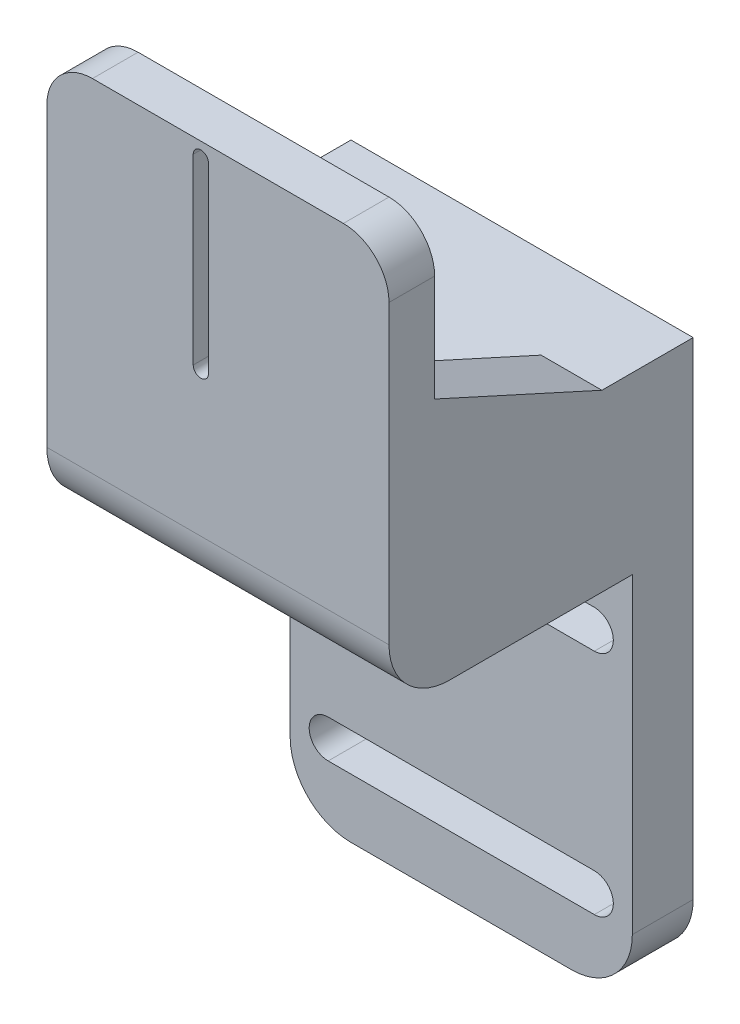
ISO-10303-21;
HEADER;
FILE_DESCRIPTION(('STEP AP214'),'2;1');
FILE_NAME('part.step','',(''),(''),'','','');
FILE_SCHEMA(('AUTOMOTIVE_DESIGN { 1 0 10303 214 1 1 1 1 }'));
ENDSEC;
DATA;
#1=APPLICATION_CONTEXT('core data for automotive mechanical design processes');
#2=APPLICATION_PROTOCOL_DEFINITION('international standard','automotive_design',2000,#1);
#3=PRODUCT_CONTEXT('',#1,'mechanical');
#4=PRODUCT('Part','Part','',(#3));
#5=PRODUCT_RELATED_PRODUCT_CATEGORY('part','',(#4));
#6=PRODUCT_DEFINITION_FORMATION('','',#4);
#7=PRODUCT_DEFINITION_CONTEXT('part definition',#1,'design');
#8=PRODUCT_DEFINITION('design','',#6,#7);
#9=PRODUCT_DEFINITION_SHAPE('','',#8);
#10=(LENGTH_UNIT() NAMED_UNIT(*) SI_UNIT(.MILLI.,.METRE.));
#11=(NAMED_UNIT(*) PLANE_ANGLE_UNIT() SI_UNIT($,.RADIAN.));
#12=(NAMED_UNIT(*) SI_UNIT($,.STERADIAN.) SOLID_ANGLE_UNIT());
#13=UNCERTAINTY_MEASURE_WITH_UNIT(LENGTH_MEASURE(1.E-05),#10,'distance_accuracy_value','');
#14=(GEOMETRIC_REPRESENTATION_CONTEXT(3) GLOBAL_UNCERTAINTY_ASSIGNED_CONTEXT((#13)) GLOBAL_UNIT_ASSIGNED_CONTEXT((#10,
#11,#12)) REPRESENTATION_CONTEXT('',''));
#15=CARTESIAN_POINT('',(0.,0.,0.));
#16=DIRECTION('',(0.,0.,1.));
#17=DIRECTION('',(1.,0.,0.));
#18=AXIS2_PLACEMENT_3D('',#15,#16,#17);
#19=CARTESIAN_POINT('',(26.5205895922188,-59.9834107085148,32.));
#20=DIRECTION('',(1.,0.,0.));
#21=DIRECTION('',(0.,0.,-1.));
#22=AXIS2_PLACEMENT_3D('',#19,#20,#21);
#23=CYLINDRICAL_SURFACE('',#22,8.);
#24=DIRECTION('',(-1.,0.,0.));
#25=VECTOR('',#24,1.);
#26=CARTESIAN_POINT('',(26.5205895922188,-67.9834107085148,32.));
#27=LINE('',#26,#25);
#28=CARTESIAN_POINT('',(71.5205895922188,-67.9834107085148,32.));
#29=VERTEX_POINT('',#28);
#30=CARTESIAN_POINT('',(26.5205895922188,-67.9834107085148,32.));
#31=VERTEX_POINT('',#30);
#32=EDGE_CURVE('E231',#29,#31,#27,.T.);
#33=ORIENTED_EDGE('',*,*,#32,.F.);
#34=CARTESIAN_POINT('',(71.5205895922188,-59.9834107085148,32.));
#35=DIRECTION('',(-1.,0.,0.));
#36=DIRECTION('',(0.,-1.,0.));
#37=AXIS2_PLACEMENT_3D('',#34,#35,#36);
#38=CIRCLE('',#37,8.);
#39=CARTESIAN_POINT('',(71.5205895922188,-59.9834107085148,40.));
#40=VERTEX_POINT('',#39);
#41=EDGE_CURVE('E408',#40,#29,#38,.F.);
#42=ORIENTED_EDGE('',*,*,#41,.F.);
#43=DIRECTION('',(-1.,0.,0.));
#44=VECTOR('',#43,1.);
#45=CARTESIAN_POINT('',(26.5205895922188,-59.9834107085148,40.));
#46=LINE('',#45,#44);
#47=CARTESIAN_POINT('',(26.5205895922188,-59.9834107085148,40.));
#48=VERTEX_POINT('',#47);
#49=EDGE_CURVE('E405',#48,#40,#46,.F.);
#50=ORIENTED_EDGE('',*,*,#49,.F.);
#51=CARTESIAN_POINT('',(26.5205895922188,-59.9834107085148,32.));
#52=DIRECTION('',(1.,0.,0.));
#53=DIRECTION('',(0.,1.,0.));
#54=AXIS2_PLACEMENT_3D('',#51,#52,#53);
#55=CIRCLE('',#54,8.);
#56=EDGE_CURVE('E410',#31,#48,#55,.F.);
#57=ORIENTED_EDGE('',*,*,#56,.F.);
#58=EDGE_LOOP('',(#33,#42,#50,#57));
#59=FACE_BOUND('',#58,.T.);
#60=ADVANCED_FACE('F40',(#59),#23,.T.);
#61=CARTESIAN_POINT('',(26.5205895922188,-44.9834107085148,8.));
#62=DIRECTION('',(0.,-1.,0.));
#63=DIRECTION('',(0.,0.,-1.));
#64=AXIS2_PLACEMENT_3D('',#61,#62,#63);
#65=PLANE('',#64);
#66=DIRECTION('',(0.,0.,1.));
#67=VECTOR('',#66,1.);
#68=CARTESIAN_POINT('',(63.5205895922188,-44.9834107085148,8.));
#69=LINE('',#68,#67);
#70=CARTESIAN_POINT('',(63.5205895922188,-44.9834107085148,12.));
#71=VERTEX_POINT('',#70);
#72=CARTESIAN_POINT('',(63.5205895922188,-44.9834107085148,34.));
#73=VERTEX_POINT('',#72);
#74=EDGE_CURVE('E239',#71,#73,#69,.T.);
#75=ORIENTED_EDGE('',*,*,#74,.F.);
#76=DIRECTION('',(-1.,0.,0.));
#77=VECTOR('',#76,1.);
#78=CARTESIAN_POINT('',(26.5205895922188,-44.9834107085148,12.));
#79=LINE('',#78,#77);
#80=CARTESIAN_POINT('',(71.5205895922188,-44.9834107085148,12.));
#81=VERTEX_POINT('',#80);
#82=EDGE_CURVE('E244',#71,#81,#79,.F.);
#83=ORIENTED_EDGE('',*,*,#82,.T.);
#84=DIRECTION('',(0.,0.,-1.));
#85=VECTOR('',#84,1.);
#86=CARTESIAN_POINT('',(71.5205895922188,-44.9834107085148,8.));
#87=LINE('',#86,#85);
#88=CARTESIAN_POINT('',(71.5205895922188,-44.9834107085148,0.));
#89=VERTEX_POINT('',#88);
#90=EDGE_CURVE('E383',#81,#89,#87,.T.);
#91=ORIENTED_EDGE('',*,*,#90,.T.);
#92=DIRECTION('',(-1.,0.,0.));
#93=VECTOR('',#92,1.);
#94=CARTESIAN_POINT('',(26.5205895922188,-44.9834107085148,0.));
#95=LINE('',#94,#93);
#96=CARTESIAN_POINT('',(26.5205895922188,-44.9834107085148,0.));
#97=VERTEX_POINT('',#96);
#98=EDGE_CURVE('E366',#89,#97,#95,.T.);
#99=ORIENTED_EDGE('',*,*,#98,.T.);
#100=DIRECTION('',(0.,0.,-1.));
#101=VECTOR('',#100,1.);
#102=CARTESIAN_POINT('',(26.5205895922188,-44.9834107085148,8.));
#103=LINE('',#102,#101);
#104=CARTESIAN_POINT('',(26.5205895922188,-44.9834107085148,34.));
#105=VERTEX_POINT('',#104);
#106=EDGE_CURVE('E372',#105,#97,#103,.T.);
#107=ORIENTED_EDGE('',*,*,#106,.F.);
#108=DIRECTION('',(-1.,0.,0.));
#109=VECTOR('',#108,1.);
#110=CARTESIAN_POINT('',(26.5205895922188,-44.9834107085148,34.));
#111=LINE('',#110,#109);
#112=EDGE_CURVE('E279',#73,#105,#111,.T.);
#113=ORIENTED_EDGE('',*,*,#112,.F.);
#114=EDGE_LOOP('',(#75,#83,#91,#99,#107,#113));
#115=FACE_BOUND('',#114,.T.);
#116=ADVANCED_FACE('F438',(#115),#65,.F.);
#117=CARTESIAN_POINT('',(0.,0.,8.));
#118=DIRECTION('',(0.,0.,1.));
#119=DIRECTION('',(1.,0.,0.));
#120=AXIS2_PLACEMENT_3D('',#117,#118,#119);
#121=PLANE('',#120);
#122=CARTESIAN_POINT('',(66.5205895922188,-106.701396252836,8.));
#123=DIRECTION('',(0.,0.,1.));
#124=DIRECTION('',(1.,0.,0.));
#125=AXIS2_PLACEMENT_3D('',#122,#123,#124);
#126=CIRCLE('',#125,2.49999999999999);
#127=CARTESIAN_POINT('',(66.5205895922188,-109.201396252836,8.));
#128=VERTEX_POINT('',#127);
#129=CARTESIAN_POINT('',(66.5205895922188,-104.201396252836,8.));
#130=VERTEX_POINT('',#129);
#131=EDGE_CURVE('E307',#128,#130,#126,.T.);
#132=ORIENTED_EDGE('',*,*,#131,.F.);
#133=DIRECTION('',(1.,0.,0.));
#134=VECTOR('',#133,1.);
#135=CARTESIAN_POINT('',(31.5205895922188,-109.201396252836,8.));
#136=LINE('',#135,#134);
#137=CARTESIAN_POINT('',(31.5205895922188,-109.201396252836,8.));
#138=VERTEX_POINT('',#137);
#139=EDGE_CURVE('E304',#138,#128,#136,.T.);
#140=ORIENTED_EDGE('',*,*,#139,.F.);
#141=CARTESIAN_POINT('',(31.5205895922188,-106.701396252836,8.));
#142=DIRECTION('',(0.,0.,1.));
#143=DIRECTION('',(1.,0.,0.));
#144=AXIS2_PLACEMENT_3D('',#141,#142,#143);
#145=CIRCLE('',#144,2.49999999999999);
#146=CARTESIAN_POINT('',(31.5205895922188,-104.201396252836,8.));
#147=VERTEX_POINT('',#146);
#148=EDGE_CURVE('E302',#147,#138,#145,.T.);
#149=ORIENTED_EDGE('',*,*,#148,.F.);
#150=DIRECTION('',(-1.,0.,0.));
#151=VECTOR('',#150,1.);
#152=CARTESIAN_POINT('',(31.5205895922188,-104.201396252836,8.));
#153=LINE('',#152,#151);
#154=EDGE_CURVE('E310',#130,#147,#153,.T.);
#155=ORIENTED_EDGE('',*,*,#154,.F.);
#156=EDGE_LOOP('',(#132,#140,#149,#155));
#157=FACE_BOUND('',#156,.T.);
#158=CARTESIAN_POINT('',(66.5205895922188,-76.7013962528361,8.));
#159=DIRECTION('',(0.,0.,1.));
#160=DIRECTION('',(1.,0.,0.));
#161=AXIS2_PLACEMENT_3D('',#158,#159,#160);
#162=CIRCLE('',#161,2.49999999999999);
#163=CARTESIAN_POINT('',(66.5205895922188,-79.2013962528361,8.));
#164=VERTEX_POINT('',#163);
#165=CARTESIAN_POINT('',(66.5205895922188,-74.2013962528361,8.));
#166=VERTEX_POINT('',#165);
#167=EDGE_CURVE('E337',#164,#166,#162,.T.);
#168=ORIENTED_EDGE('',*,*,#167,.F.);
#169=DIRECTION('',(1.,0.,0.));
#170=VECTOR('',#169,1.);
#171=CARTESIAN_POINT('',(31.5205895922188,-79.2013962528361,8.));
#172=LINE('',#171,#170);
#173=CARTESIAN_POINT('',(31.5205895922188,-79.2013962528361,8.));
#174=VERTEX_POINT('',#173);
#175=EDGE_CURVE('E334',#174,#164,#172,.T.);
#176=ORIENTED_EDGE('',*,*,#175,.F.);
#177=CARTESIAN_POINT('',(31.5205895922188,-76.7013962528361,8.));
#178=DIRECTION('',(0.,0.,1.));
#179=DIRECTION('',(1.,0.,0.));
#180=AXIS2_PLACEMENT_3D('',#177,#178,#179);
#181=CIRCLE('',#180,2.5);
#182=CARTESIAN_POINT('',(31.5205895922188,-74.2013962528361,8.));
#183=VERTEX_POINT('',#182);
#184=EDGE_CURVE('E332',#183,#174,#181,.T.);
#185=ORIENTED_EDGE('',*,*,#184,.F.);
#186=DIRECTION('',(-1.,0.,0.));
#187=VECTOR('',#186,1.);
#188=CARTESIAN_POINT('',(31.5205895922188,-74.2013962528361,8.));
#189=LINE('',#188,#187);
#190=EDGE_CURVE('E340',#166,#183,#189,.T.);
#191=ORIENTED_EDGE('',*,*,#190,.F.);
#192=EDGE_LOOP('',(#168,#176,#185,#191));
#193=FACE_BOUND('',#192,.T.);
#194=DIRECTION('',(1.,0.,0.));
#195=VECTOR('',#194,1.);
#196=CARTESIAN_POINT('',(26.5205895922188,-116.983410708515,8.));
#197=LINE('',#196,#195);
#198=CARTESIAN_POINT('',(34.5205895922188,-116.983410708515,8.));
#199=VERTEX_POINT('',#198);
#200=CARTESIAN_POINT('',(63.5205895922188,-116.983410708515,8.));
#201=VERTEX_POINT('',#200);
#202=EDGE_CURVE('E365',#199,#201,#197,.T.);
#203=ORIENTED_EDGE('',*,*,#202,.T.);
#204=CARTESIAN_POINT('',(63.5205895922188,-108.983410708515,8.));
#205=DIRECTION('',(0.,0.,1.));
#206=DIRECTION('',(1.,0.,0.));
#207=AXIS2_PLACEMENT_3D('',#204,#205,#206);
#208=CIRCLE('',#207,8.);
#209=CARTESIAN_POINT('',(71.5205895922188,-108.983410708515,8.));
#210=VERTEX_POINT('',#209);
#211=EDGE_CURVE('E400',#201,#210,#208,.T.);
#212=ORIENTED_EDGE('',*,*,#211,.T.);
#213=DIRECTION('',(0.,1.,0.));
#214=VECTOR('',#213,1.);
#215=CARTESIAN_POINT('',(71.5205895922188,-44.9834107085148,8.));
#216=LINE('',#215,#214);
#217=CARTESIAN_POINT('',(71.5205895922188,-67.9834107085148,8.));
#218=VERTEX_POINT('',#217);
#219=EDGE_CURVE('E369',#210,#218,#216,.T.);
#220=ORIENTED_EDGE('',*,*,#219,.T.);
#221=DIRECTION('',(1.,0.,0.));
#222=VECTOR('',#221,1.);
#223=CARTESIAN_POINT('',(26.5205895922188,-67.9834107085148,8.));
#224=LINE('',#223,#222);
#225=CARTESIAN_POINT('',(26.5205895922188,-67.9834107085148,8.));
#226=VERTEX_POINT('',#225);
#227=EDGE_CURVE('E290',#226,#218,#224,.T.);
#228=ORIENTED_EDGE('',*,*,#227,.F.);
#229=DIRECTION('',(0.,-1.,0.));
#230=VECTOR('',#229,1.);
#231=CARTESIAN_POINT('',(26.5205895922188,-44.9834107085148,8.));
#232=LINE('',#231,#230);
#233=CARTESIAN_POINT('',(26.5205895922188,-108.983410708515,8.));
#234=VERTEX_POINT('',#233);
#235=EDGE_CURVE('E362',#226,#234,#232,.T.);
#236=ORIENTED_EDGE('',*,*,#235,.T.);
#237=CARTESIAN_POINT('',(34.5205895922188,-108.983410708515,8.));
#238=DIRECTION('',(0.,0.,1.));
#239=DIRECTION('',(1.,0.,0.));
#240=AXIS2_PLACEMENT_3D('',#237,#238,#239);
#241=CIRCLE('',#240,8.);
#242=EDGE_CURVE('E398',#234,#199,#241,.T.);
#243=ORIENTED_EDGE('',*,*,#242,.T.);
#244=EDGE_LOOP('',(#203,#212,#220,#228,#236,#243));
#245=FACE_BOUND('',#244,.T.);
#246=ADVANCED_FACE('F454',(#157,#193,#245),#121,.T.);
#247=CARTESIAN_POINT('',(0.,0.,0.));
#248=DIRECTION('',(0.,0.,1.));
#249=DIRECTION('',(1.,0.,0.));
#250=AXIS2_PLACEMENT_3D('',#247,#248,#249);
#251=PLANE('',#250);
#252=DIRECTION('',(1.,0.,0.));
#253=VECTOR('',#252,1.);
#254=CARTESIAN_POINT('',(31.5205895922188,-109.201396252836,0.));
#255=LINE('',#254,#253);
#256=CARTESIAN_POINT('',(31.5205895922188,-109.201396252836,0.));
#257=VERTEX_POINT('',#256);
#258=CARTESIAN_POINT('',(66.5205895922188,-109.201396252836,0.));
#259=VERTEX_POINT('',#258);
#260=EDGE_CURVE('E315',#257,#259,#255,.T.);
#261=ORIENTED_EDGE('',*,*,#260,.T.);
#262=CARTESIAN_POINT('',(66.5205895922188,-106.701396252836,0.));
#263=DIRECTION('',(0.,0.,1.));
#264=DIRECTION('',(1.,0.,0.));
#265=AXIS2_PLACEMENT_3D('',#262,#263,#264);
#266=CIRCLE('',#265,2.49999999999999);
#267=CARTESIAN_POINT('',(66.5205895922188,-104.201396252836,0.));
#268=VERTEX_POINT('',#267);
#269=EDGE_CURVE('E317',#259,#268,#266,.T.);
#270=ORIENTED_EDGE('',*,*,#269,.T.);
#271=DIRECTION('',(-1.,0.,0.));
#272=VECTOR('',#271,1.);
#273=CARTESIAN_POINT('',(31.5205895922188,-104.201396252836,0.));
#274=LINE('',#273,#272);
#275=CARTESIAN_POINT('',(31.5205895922188,-104.201396252836,0.));
#276=VERTEX_POINT('',#275);
#277=EDGE_CURVE('E305',#268,#276,#274,.T.);
#278=ORIENTED_EDGE('',*,*,#277,.T.);
#279=CARTESIAN_POINT('',(31.5205895922188,-106.701396252836,0.));
#280=DIRECTION('',(0.,0.,1.));
#281=DIRECTION('',(1.,0.,0.));
#282=AXIS2_PLACEMENT_3D('',#279,#280,#281);
#283=CIRCLE('',#282,2.49999999999999);
#284=EDGE_CURVE('E301',#276,#257,#283,.T.);
#285=ORIENTED_EDGE('',*,*,#284,.T.);
#286=EDGE_LOOP('',(#261,#270,#278,#285));
#287=FACE_BOUND('',#286,.T.);
#288=DIRECTION('',(1.,0.,0.));
#289=VECTOR('',#288,1.);
#290=CARTESIAN_POINT('',(31.5205895922188,-79.2013962528361,0.));
#291=LINE('',#290,#289);
#292=CARTESIAN_POINT('',(31.5205895922188,-79.2013962528361,0.));
#293=VERTEX_POINT('',#292);
#294=CARTESIAN_POINT('',(66.5205895922188,-79.2013962528361,0.));
#295=VERTEX_POINT('',#294);
#296=EDGE_CURVE('E345',#293,#295,#291,.T.);
#297=ORIENTED_EDGE('',*,*,#296,.T.);
#298=CARTESIAN_POINT('',(66.5205895922188,-76.7013962528361,0.));
#299=DIRECTION('',(0.,0.,1.));
#300=DIRECTION('',(1.,0.,0.));
#301=AXIS2_PLACEMENT_3D('',#298,#299,#300);
#302=CIRCLE('',#301,2.49999999999999);
#303=CARTESIAN_POINT('',(66.5205895922188,-74.2013962528361,0.));
#304=VERTEX_POINT('',#303);
#305=EDGE_CURVE('E347',#295,#304,#302,.T.);
#306=ORIENTED_EDGE('',*,*,#305,.T.);
#307=DIRECTION('',(-1.,0.,0.));
#308=VECTOR('',#307,1.);
#309=CARTESIAN_POINT('',(31.5205895922188,-74.2013962528361,0.));
#310=LINE('',#309,#308);
#311=CARTESIAN_POINT('',(31.5205895922188,-74.2013962528361,0.));
#312=VERTEX_POINT('',#311);
#313=EDGE_CURVE('E335',#304,#312,#310,.T.);
#314=ORIENTED_EDGE('',*,*,#313,.T.);
#315=CARTESIAN_POINT('',(31.5205895922188,-76.7013962528361,0.));
#316=DIRECTION('',(0.,0.,1.));
#317=DIRECTION('',(1.,0.,0.));
#318=AXIS2_PLACEMENT_3D('',#315,#316,#317);
#319=CIRCLE('',#318,2.5);
#320=EDGE_CURVE('E331',#312,#293,#319,.T.);
#321=ORIENTED_EDGE('',*,*,#320,.T.);
#322=EDGE_LOOP('',(#297,#306,#314,#321));
#323=FACE_BOUND('',#322,.T.);
#324=CARTESIAN_POINT('',(63.5205895922188,-108.983410708515,0.));
#325=DIRECTION('',(0.,0.,1.));
#326=DIRECTION('',(1.,0.,0.));
#327=AXIS2_PLACEMENT_3D('',#324,#325,#326);
#328=CIRCLE('',#327,8.);
#329=CARTESIAN_POINT('',(71.5205895922188,-108.983410708515,0.));
#330=VERTEX_POINT('',#329);
#331=CARTESIAN_POINT('',(63.5205895922188,-116.983410708515,0.));
#332=VERTEX_POINT('',#331);
#333=EDGE_CURVE('E391',#330,#332,#328,.F.);
#334=ORIENTED_EDGE('',*,*,#333,.T.);
#335=DIRECTION('',(1.,0.,0.));
#336=VECTOR('',#335,1.);
#337=CARTESIAN_POINT('',(26.5205895922188,-116.983410708515,0.));
#338=LINE('',#337,#336);
#339=CARTESIAN_POINT('',(34.5205895922188,-116.983410708515,0.));
#340=VERTEX_POINT('',#339);
#341=EDGE_CURVE('E375',#340,#332,#338,.T.);
#342=ORIENTED_EDGE('',*,*,#341,.F.);
#343=CARTESIAN_POINT('',(34.5205895922188,-108.983410708515,0.));
#344=DIRECTION('',(0.,0.,1.));
#345=DIRECTION('',(1.,0.,0.));
#346=AXIS2_PLACEMENT_3D('',#343,#344,#345);
#347=CIRCLE('',#346,8.);
#348=CARTESIAN_POINT('',(26.5205895922188,-108.983410708515,0.));
#349=VERTEX_POINT('',#348);
#350=EDGE_CURVE('E389',#340,#349,#347,.F.);
#351=ORIENTED_EDGE('',*,*,#350,.T.);
#352=DIRECTION('',(0.,-1.,0.));
#353=VECTOR('',#352,1.);
#354=CARTESIAN_POINT('',(26.5205895922188,-44.9834107085148,0.));
#355=LINE('',#354,#353);
#356=EDGE_CURVE('E361',#97,#349,#355,.T.);
#357=ORIENTED_EDGE('',*,*,#356,.F.);
#358=ORIENTED_EDGE('',*,*,#98,.F.);
#359=DIRECTION('',(0.,1.,0.));
#360=VECTOR('',#359,1.);
#361=CARTESIAN_POINT('',(71.5205895922188,-44.9834107085148,0.));
#362=LINE('',#361,#360);
#363=EDGE_CURVE('E378',#330,#89,#362,.T.);
#364=ORIENTED_EDGE('',*,*,#363,.F.);
#365=EDGE_LOOP('',(#334,#342,#351,#357,#358,#364));
#366=FACE_BOUND('',#365,.T.);
#367=ADVANCED_FACE('F442',(#287,#323,#366),#251,.F.);
#368=CARTESIAN_POINT('',(26.5205895922188,-44.9834107085148,8.));
#369=DIRECTION('',(1.,0.,0.));
#370=DIRECTION('',(0.,1.,0.));
#371=AXIS2_PLACEMENT_3D('',#368,#369,#370);
#372=PLANE('',#371);
#373=DIRECTION('',(0.,-1.,0.));
#374=VECTOR('',#373,1.);
#375=CARTESIAN_POINT('',(26.5205895922188,-44.9834107085148,40.));
#376=LINE('',#375,#374);
#377=CARTESIAN_POINT('',(26.5205895922188,-20.9834107085148,40.));
#378=VERTEX_POINT('',#377);
#379=EDGE_CURVE('E291',#378,#48,#376,.T.);
#380=ORIENTED_EDGE('',*,*,#379,.F.);
#381=DIRECTION('',(0.,0.,1.));
#382=VECTOR('',#381,1.);
#383=CARTESIAN_POINT('',(26.5205895922188,-20.9834107085148,8.));
#384=LINE('',#383,#382);
#385=CARTESIAN_POINT('',(26.5205895922188,-20.9834107085148,34.));
#386=VERTEX_POINT('',#385);
#387=EDGE_CURVE('E11',#378,#386,#384,.F.);
#388=ORIENTED_EDGE('',*,*,#387,.T.);
#389=DIRECTION('',(0.,-1.,0.));
#390=VECTOR('',#389,1.);
#391=CARTESIAN_POINT('',(26.5205895922188,-14.9834107085148,34.));
#392=LINE('',#391,#390);
#393=EDGE_CURVE('E286',#386,#105,#392,.T.);
#394=ORIENTED_EDGE('',*,*,#393,.T.);
#395=ORIENTED_EDGE('',*,*,#106,.T.);
#396=ORIENTED_EDGE('',*,*,#356,.T.);
#397=DIRECTION('',(0.,0.,-1.));
#398=VECTOR('',#397,1.);
#399=CARTESIAN_POINT('',(26.5205895922188,-108.983410708515,8.));
#400=LINE('',#399,#398);
#401=EDGE_CURVE('E232',#349,#234,#400,.F.);
#402=ORIENTED_EDGE('',*,*,#401,.T.);
#403=ORIENTED_EDGE('',*,*,#235,.F.);
#404=DIRECTION('',(0.,0.,-1.));
#405=VECTOR('',#404,1.);
#406=CARTESIAN_POINT('',(26.5205895922188,-67.9834107085148,40.));
#407=LINE('',#406,#405);
#408=EDGE_CURVE('E299',#31,#226,#407,.T.);
#409=ORIENTED_EDGE('',*,*,#408,.F.);
#410=ORIENTED_EDGE('',*,*,#56,.T.);
#411=EDGE_LOOP('',(#380,#388,#394,#395,#396,#402,#403,#409,#410));
#412=FACE_BOUND('',#411,.T.);
#413=ADVANCED_FACE('F446',(#412),#372,.F.);
#414=CARTESIAN_POINT('',(26.5205895922188,-116.983410708515,8.));
#415=DIRECTION('',(0.,1.,0.));
#416=DIRECTION('',(0.,0.,1.));
#417=AXIS2_PLACEMENT_3D('',#414,#415,#416);
#418=PLANE('',#417);
#419=ORIENTED_EDGE('',*,*,#341,.T.);
#420=DIRECTION('',(0.,0.,-1.));
#421=VECTOR('',#420,1.);
#422=CARTESIAN_POINT('',(63.5205895922188,-116.983410708515,8.));
#423=LINE('',#422,#421);
#424=EDGE_CURVE('E396',#332,#201,#423,.F.);
#425=ORIENTED_EDGE('',*,*,#424,.T.);
#426=ORIENTED_EDGE('',*,*,#202,.F.);
#427=DIRECTION('',(0.,0.,-1.));
#428=VECTOR('',#427,1.);
#429=CARTESIAN_POINT('',(34.5205895922188,-116.983410708515,8.));
#430=LINE('',#429,#428);
#431=EDGE_CURVE('E393',#199,#340,#430,.T.);
#432=ORIENTED_EDGE('',*,*,#431,.T.);
#433=EDGE_LOOP('',(#419,#425,#426,#432));
#434=FACE_BOUND('',#433,.T.);
#435=ADVANCED_FACE('F458',(#434),#418,.F.);
#436=CARTESIAN_POINT('',(71.5205895922188,-44.9834107085148,8.));
#437=DIRECTION('',(-1.,0.,0.));
#438=DIRECTION('',(0.,-1.,0.));
#439=AXIS2_PLACEMENT_3D('',#436,#437,#438);
#440=PLANE('',#439);
#441=DIRECTION('',(0.,-1.,0.));
#442=VECTOR('',#441,1.);
#443=CARTESIAN_POINT('',(71.5205895922188,-14.9834107085148,34.));
#444=LINE('',#443,#442);
#445=CARTESIAN_POINT('',(71.5205895922188,-20.9834107085148,34.));
#446=VERTEX_POINT('',#445);
#447=CARTESIAN_POINT('',(71.5205895922188,-34.9834107085148,34.));
#448=VERTEX_POINT('',#447);
#449=EDGE_CURVE('E226',#446,#448,#444,.T.);
#450=ORIENTED_EDGE('',*,*,#449,.F.);
#451=DIRECTION('',(0.,0.,-1.));
#452=VECTOR('',#451,1.);
#453=CARTESIAN_POINT('',(71.5205895922188,-20.9834107085148,8.));
#454=LINE('',#453,#452);
#455=CARTESIAN_POINT('',(71.5205895922188,-20.9834107085148,40.));
#456=VERTEX_POINT('',#455);
#457=EDGE_CURVE('E63',#446,#456,#454,.F.);
#458=ORIENTED_EDGE('',*,*,#457,.T.);
#459=DIRECTION('',(0.,1.,0.));
#460=VECTOR('',#459,1.);
#461=CARTESIAN_POINT('',(71.5205895922188,-44.9834107085148,40.));
#462=LINE('',#461,#460);
#463=EDGE_CURVE('E293',#40,#456,#462,.T.);
#464=ORIENTED_EDGE('',*,*,#463,.F.);
#465=ORIENTED_EDGE('',*,*,#41,.T.);
#466=DIRECTION('',(0.,0.,-1.));
#467=VECTOR('',#466,1.);
#468=CARTESIAN_POINT('',(71.5205895922188,-67.9834107085148,40.));
#469=LINE('',#468,#467);
#470=EDGE_CURVE('E295',#29,#218,#469,.T.);
#471=ORIENTED_EDGE('',*,*,#470,.T.);
#472=ORIENTED_EDGE('',*,*,#219,.F.);
#473=DIRECTION('',(0.,0.,-1.));
#474=VECTOR('',#473,1.);
#475=CARTESIAN_POINT('',(71.5205895922188,-108.983410708515,8.));
#476=LINE('',#475,#474);
#477=EDGE_CURVE('E386',#210,#330,#476,.T.);
#478=ORIENTED_EDGE('',*,*,#477,.T.);
#479=ORIENTED_EDGE('',*,*,#363,.T.);
#480=ORIENTED_EDGE('',*,*,#90,.F.);
#481=DIRECTION('',(0.,-0.413802944301184,-0.910366477462605));
#482=VECTOR('',#481,1.);
#483=CARTESIAN_POINT('',(71.5205895922188,-34.9834107085148,34.));
#484=LINE('',#483,#482);
#485=EDGE_CURVE('E240',#448,#81,#484,.T.);
#486=ORIENTED_EDGE('',*,*,#485,.F.);
#487=EDGE_LOOP('',(#450,#458,#464,#465,#471,#472,#478,#479,#480,#486));
#488=FACE_BOUND('',#487,.T.);
#489=ADVANCED_FACE('F433',(#488),#440,.F.);
#490=CARTESIAN_POINT('',(31.5205895922188,-76.7013962528361,8.));
#491=DIRECTION('',(0.,0.,-1.));
#492=DIRECTION('',(-1.,0.,0.));
#493=AXIS2_PLACEMENT_3D('',#490,#491,#492);
#494=CYLINDRICAL_SURFACE('',#493,2.5);
#495=ORIENTED_EDGE('',*,*,#320,.F.);
#496=DIRECTION('',(0.,0.,-1.));
#497=VECTOR('',#496,1.);
#498=CARTESIAN_POINT('',(31.5205895922188,-74.2013962528361,8.));
#499=LINE('',#498,#497);
#500=EDGE_CURVE('E342',#183,#312,#499,.T.);
#501=ORIENTED_EDGE('',*,*,#500,.F.);
#502=ORIENTED_EDGE('',*,*,#184,.T.);
#503=DIRECTION('',(0.,0.,-1.));
#504=VECTOR('',#503,1.);
#505=CARTESIAN_POINT('',(31.5205895922188,-79.2013962528361,8.));
#506=LINE('',#505,#504);
#507=EDGE_CURVE('E358',#174,#293,#506,.T.);
#508=ORIENTED_EDGE('',*,*,#507,.T.);
#509=EDGE_LOOP('',(#495,#501,#502,#508));
#510=FACE_BOUND('',#509,.T.);
#511=ADVANCED_FACE('F544',(#510),#494,.F.);
#512=CARTESIAN_POINT('',(31.5205895922188,-79.2013962528361,8.));
#513=DIRECTION('',(0.,1.,0.));
#514=DIRECTION('',(-1.,0.,0.));
#515=AXIS2_PLACEMENT_3D('',#512,#513,#514);
#516=PLANE('',#515);
#517=DIRECTION('',(0.,0.,-1.));
#518=VECTOR('',#517,1.);
#519=CARTESIAN_POINT('',(66.5205895922188,-79.2013962528361,8.));
#520=LINE('',#519,#518);
#521=EDGE_CURVE('E355',#164,#295,#520,.T.);
#522=ORIENTED_EDGE('',*,*,#521,.T.);
#523=ORIENTED_EDGE('',*,*,#296,.F.);
#524=ORIENTED_EDGE('',*,*,#507,.F.);
#525=ORIENTED_EDGE('',*,*,#175,.T.);
#526=EDGE_LOOP('',(#522,#523,#524,#525));
#527=FACE_BOUND('',#526,.T.);
#528=ADVANCED_FACE('F540',(#527),#516,.T.);
#529=CARTESIAN_POINT('',(66.5205895922188,-76.7013962528361,8.));
#530=DIRECTION('',(0.,0.,-1.));
#531=DIRECTION('',(-1.,0.,0.));
#532=AXIS2_PLACEMENT_3D('',#529,#530,#531);
#533=CYLINDRICAL_SURFACE('',#532,2.49999999999999);
#534=ORIENTED_EDGE('',*,*,#305,.F.);
#535=ORIENTED_EDGE('',*,*,#521,.F.);
#536=ORIENTED_EDGE('',*,*,#167,.T.);
#537=DIRECTION('',(0.,0.,-1.));
#538=VECTOR('',#537,1.);
#539=CARTESIAN_POINT('',(66.5205895922188,-74.2013962528361,8.));
#540=LINE('',#539,#538);
#541=EDGE_CURVE('E353',#166,#304,#540,.T.);
#542=ORIENTED_EDGE('',*,*,#541,.T.);
#543=EDGE_LOOP('',(#534,#535,#536,#542));
#544=FACE_BOUND('',#543,.T.);
#545=ADVANCED_FACE('F536',(#544),#533,.F.);
#546=CARTESIAN_POINT('',(31.5205895922188,-74.2013962528361,8.));
#547=DIRECTION('',(0.,-1.,0.));
#548=DIRECTION('',(1.,0.,0.));
#549=AXIS2_PLACEMENT_3D('',#546,#547,#548);
#550=PLANE('',#549);
#551=ORIENTED_EDGE('',*,*,#190,.T.);
#552=ORIENTED_EDGE('',*,*,#500,.T.);
#553=ORIENTED_EDGE('',*,*,#313,.F.);
#554=ORIENTED_EDGE('',*,*,#541,.F.);
#555=EDGE_LOOP('',(#551,#552,#553,#554));
#556=FACE_BOUND('',#555,.T.);
#557=ADVANCED_FACE('F532',(#556),#550,.T.);
#558=CARTESIAN_POINT('',(31.5205895922188,-106.701396252836,8.));
#559=DIRECTION('',(0.,0.,-1.));
#560=DIRECTION('',(-1.,0.,0.));
#561=AXIS2_PLACEMENT_3D('',#558,#559,#560);
#562=CYLINDRICAL_SURFACE('',#561,2.49999999999999);
#563=ORIENTED_EDGE('',*,*,#284,.F.);
#564=DIRECTION('',(0.,0.,-1.));
#565=VECTOR('',#564,1.);
#566=CARTESIAN_POINT('',(31.5205895922188,-104.201396252836,8.));
#567=LINE('',#566,#565);
#568=EDGE_CURVE('E312',#147,#276,#567,.T.);
#569=ORIENTED_EDGE('',*,*,#568,.F.);
#570=ORIENTED_EDGE('',*,*,#148,.T.);
#571=DIRECTION('',(0.,0.,-1.));
#572=VECTOR('',#571,1.);
#573=CARTESIAN_POINT('',(31.5205895922188,-109.201396252836,8.));
#574=LINE('',#573,#572);
#575=EDGE_CURVE('E328',#138,#257,#574,.T.);
#576=ORIENTED_EDGE('',*,*,#575,.T.);
#577=EDGE_LOOP('',(#563,#569,#570,#576));
#578=FACE_BOUND('',#577,.T.);
#579=ADVANCED_FACE('F528',(#578),#562,.F.);
#580=CARTESIAN_POINT('',(31.5205895922188,-109.201396252836,8.));
#581=DIRECTION('',(0.,1.,0.));
#582=DIRECTION('',(0.,0.,1.));
#583=AXIS2_PLACEMENT_3D('',#580,#581,#582);
#584=PLANE('',#583);
#585=DIRECTION('',(0.,0.,-1.));
#586=VECTOR('',#585,1.);
#587=CARTESIAN_POINT('',(66.5205895922188,-109.201396252836,8.));
#588=LINE('',#587,#586);
#589=EDGE_CURVE('E325',#128,#259,#588,.T.);
#590=ORIENTED_EDGE('',*,*,#589,.T.);
#591=ORIENTED_EDGE('',*,*,#260,.F.);
#592=ORIENTED_EDGE('',*,*,#575,.F.);
#593=ORIENTED_EDGE('',*,*,#139,.T.);
#594=EDGE_LOOP('',(#590,#591,#592,#593));
#595=FACE_BOUND('',#594,.T.);
#596=ADVANCED_FACE('F524',(#595),#584,.T.);
#597=CARTESIAN_POINT('',(66.5205895922188,-106.701396252836,8.));
#598=DIRECTION('',(0.,0.,-1.));
#599=DIRECTION('',(-1.,0.,0.));
#600=AXIS2_PLACEMENT_3D('',#597,#598,#599);
#601=CYLINDRICAL_SURFACE('',#600,2.49999999999999);
#602=ORIENTED_EDGE('',*,*,#269,.F.);
#603=ORIENTED_EDGE('',*,*,#589,.F.);
#604=ORIENTED_EDGE('',*,*,#131,.T.);
#605=DIRECTION('',(0.,0.,-1.));
#606=VECTOR('',#605,1.);
#607=CARTESIAN_POINT('',(66.5205895922188,-104.201396252836,8.));
#608=LINE('',#607,#606);
#609=EDGE_CURVE('E323',#130,#268,#608,.T.);
#610=ORIENTED_EDGE('',*,*,#609,.T.);
#611=EDGE_LOOP('',(#602,#603,#604,#610));
#612=FACE_BOUND('',#611,.T.);
#613=ADVANCED_FACE('F520',(#612),#601,.F.);
#614=CARTESIAN_POINT('',(31.5205895922188,-104.201396252836,8.));
#615=DIRECTION('',(0.,-1.,0.));
#616=DIRECTION('',(0.,0.,-1.));
#617=AXIS2_PLACEMENT_3D('',#614,#615,#616);
#618=PLANE('',#617);
#619=ORIENTED_EDGE('',*,*,#154,.T.);
#620=ORIENTED_EDGE('',*,*,#568,.T.);
#621=ORIENTED_EDGE('',*,*,#277,.F.);
#622=ORIENTED_EDGE('',*,*,#609,.F.);
#623=EDGE_LOOP('',(#619,#620,#621,#622));
#624=FACE_BOUND('',#623,.T.);
#625=ADVANCED_FACE('F517',(#624),#618,.T.);
#626=CARTESIAN_POINT('',(26.5205895922188,-67.9834107085148,40.));
#627=DIRECTION('',(0.,1.,0.));
#628=DIRECTION('',(0.,0.,1.));
#629=AXIS2_PLACEMENT_3D('',#626,#627,#628);
#630=PLANE('',#629);
#631=ORIENTED_EDGE('',*,*,#470,.F.);
#632=ORIENTED_EDGE('',*,*,#32,.T.);
#633=ORIENTED_EDGE('',*,*,#408,.T.);
#634=ORIENTED_EDGE('',*,*,#227,.T.);
#635=EDGE_LOOP('',(#631,#632,#633,#634));
#636=FACE_BOUND('',#635,.T.);
#637=ADVANCED_FACE('F467',(#636),#630,.F.);
#638=CARTESIAN_POINT('',(0.,0.,40.));
#639=DIRECTION('',(0.,0.,1.));
#640=DIRECTION('',(1.,0.,0.));
#641=AXIS2_PLACEMENT_3D('',#638,#639,#640);
#642=PLANE('',#641);
#643=ORIENTED_EDGE('',*,*,#463,.T.);
#644=CARTESIAN_POINT('',(65.5205895922188,-20.9834107085148,40.));
#645=DIRECTION('',(0.,0.,1.));
#646=DIRECTION('',(1.,0.,0.));
#647=AXIS2_PLACEMENT_3D('',#644,#645,#646);
#648=CIRCLE('',#647,6.);
#649=CARTESIAN_POINT('',(65.5205895922188,-14.9834107085148,40.));
#650=VERTEX_POINT('',#649);
#651=EDGE_CURVE('E48',#456,#650,#648,.T.);
#652=ORIENTED_EDGE('',*,*,#651,.T.);
#653=DIRECTION('',(1.,0.,0.));
#654=VECTOR('',#653,1.);
#655=CARTESIAN_POINT('',(26.5205895922188,-14.9834107085148,40.));
#656=LINE('',#655,#654);
#657=CARTESIAN_POINT('',(32.5205895922188,-14.9834107085148,40.));
#658=VERTEX_POINT('',#657);
#659=EDGE_CURVE('E280',#658,#650,#656,.T.);
#660=ORIENTED_EDGE('',*,*,#659,.F.);
#661=CARTESIAN_POINT('',(32.5205895922188,-20.9834107085148,40.));
#662=DIRECTION('',(0.,0.,1.));
#663=DIRECTION('',(1.,0.,0.));
#664=AXIS2_PLACEMENT_3D('',#661,#662,#663);
#665=CIRCLE('',#664,6.);
#666=EDGE_CURVE('E55',#658,#378,#665,.T.);
#667=ORIENTED_EDGE('',*,*,#666,.T.);
#668=ORIENTED_EDGE('',*,*,#379,.T.);
#669=ORIENTED_EDGE('',*,*,#49,.T.);
#670=EDGE_LOOP('',(#643,#652,#660,#667,#668,#669));
#671=FACE_BOUND('',#670,.T.);
#672=CARTESIAN_POINT('',(46.7705895922188,-16.9834107085148,40.));
#673=DIRECTION('',(0.,0.,1.));
#674=DIRECTION('',(1.,0.,0.));
#675=AXIS2_PLACEMENT_3D('',#672,#673,#674);
#676=CIRCLE('',#675,1.00000000000001);
#677=CARTESIAN_POINT('',(47.7705895922188,-16.9834107085148,40.));
#678=VERTEX_POINT('',#677);
#679=CARTESIAN_POINT('',(45.7705895922188,-16.9834107085148,40.));
#680=VERTEX_POINT('',#679);
#681=EDGE_CURVE('E250',#678,#680,#676,.T.);
#682=ORIENTED_EDGE('',*,*,#681,.F.);
#683=DIRECTION('',(0.,1.,0.));
#684=VECTOR('',#683,1.);
#685=CARTESIAN_POINT('',(47.7705895922188,-16.9834107085148,40.));
#686=LINE('',#685,#684);
#687=CARTESIAN_POINT('',(47.7705895922188,-40.9834107085148,40.));
#688=VERTEX_POINT('',#687);
#689=EDGE_CURVE('E267',#688,#678,#686,.T.);
#690=ORIENTED_EDGE('',*,*,#689,.F.);
#691=CARTESIAN_POINT('',(46.7705895922188,-40.9834107085148,40.));
#692=DIRECTION('',(0.,0.,1.));
#693=DIRECTION('',(1.,0.,0.));
#694=AXIS2_PLACEMENT_3D('',#691,#692,#693);
#695=CIRCLE('',#694,1.00000000000001);
#696=CARTESIAN_POINT('',(45.7705895922188,-40.9834107085148,40.));
#697=VERTEX_POINT('',#696);
#698=EDGE_CURVE('E264',#697,#688,#695,.T.);
#699=ORIENTED_EDGE('',*,*,#698,.F.);
#700=DIRECTION('',(0.,-1.,0.));
#701=VECTOR('',#700,1.);
#702=CARTESIAN_POINT('',(45.7705895922188,-16.9834107085148,40.));
#703=LINE('',#702,#701);
#704=EDGE_CURVE('E261',#680,#697,#703,.T.);
#705=ORIENTED_EDGE('',*,*,#704,.F.);
#706=EDGE_LOOP('',(#682,#690,#699,#705));
#707=FACE_BOUND('',#706,.T.);
#708=ADVANCED_FACE('F425',(#671,#707),#642,.T.);
#709=CARTESIAN_POINT('',(26.5205895922188,-14.9834107085148,34.));
#710=DIRECTION('',(0.,0.,1.));
#711=DIRECTION('',(1.,0.,0.));
#712=AXIS2_PLACEMENT_3D('',#709,#710,#711);
#713=PLANE('',#712);
#714=DIRECTION('',(0.,-1.,0.));
#715=VECTOR('',#714,1.);
#716=CARTESIAN_POINT('',(47.7705895922188,-16.9834107085148,34.));
#717=LINE('',#716,#715);
#718=CARTESIAN_POINT('',(47.7705895922188,-16.9834107085148,34.));
#719=VERTEX_POINT('',#718);
#720=CARTESIAN_POINT('',(47.7705895922188,-40.9834107085148,34.));
#721=VERTEX_POINT('',#720);
#722=EDGE_CURVE('E254',#719,#721,#717,.T.);
#723=ORIENTED_EDGE('',*,*,#722,.F.);
#724=CARTESIAN_POINT('',(46.7705895922188,-16.9834107085148,34.));
#725=DIRECTION('',(0.,0.,1.));
#726=DIRECTION('',(1.,0.,0.));
#727=AXIS2_PLACEMENT_3D('',#724,#725,#726);
#728=CIRCLE('',#727,1.00000000000001);
#729=CARTESIAN_POINT('',(45.7705895922188,-16.9834107085148,34.));
#730=VERTEX_POINT('',#729);
#731=EDGE_CURVE('E257',#730,#719,#728,.F.);
#732=ORIENTED_EDGE('',*,*,#731,.F.);
#733=DIRECTION('',(0.,1.,0.));
#734=VECTOR('',#733,1.);
#735=CARTESIAN_POINT('',(45.7705895922188,-16.9834107085148,34.));
#736=LINE('',#735,#734);
#737=CARTESIAN_POINT('',(45.7705895922188,-40.9834107085148,34.));
#738=VERTEX_POINT('',#737);
#739=EDGE_CURVE('E259',#738,#730,#736,.T.);
#740=ORIENTED_EDGE('',*,*,#739,.F.);
#741=CARTESIAN_POINT('',(46.7705895922188,-40.9834107085148,34.));
#742=DIRECTION('',(0.,0.,1.));
#743=DIRECTION('',(1.,0.,0.));
#744=AXIS2_PLACEMENT_3D('',#741,#742,#743);
#745=CIRCLE('',#744,1.00000000000001);
#746=EDGE_CURVE('E251',#721,#738,#745,.F.);
#747=ORIENTED_EDGE('',*,*,#746,.F.);
#748=EDGE_LOOP('',(#723,#732,#740,#747));
#749=FACE_BOUND('',#748,.T.);
#750=DIRECTION('',(-1.,0.,0.));
#751=VECTOR('',#750,1.);
#752=CARTESIAN_POINT('',(26.5205895922188,-14.9834107085148,34.));
#753=LINE('',#752,#751);
#754=CARTESIAN_POINT('',(65.5205895922188,-14.9834107085148,34.));
#755=VERTEX_POINT('',#754);
#756=CARTESIAN_POINT('',(32.5205895922188,-14.9834107085148,34.));
#757=VERTEX_POINT('',#756);
#758=EDGE_CURVE('E283',#755,#757,#753,.T.);
#759=ORIENTED_EDGE('',*,*,#758,.F.);
#760=CARTESIAN_POINT('',(65.5205895922188,-20.9834107085148,34.));
#761=DIRECTION('',(0.,0.,1.));
#762=DIRECTION('',(1.,0.,0.));
#763=AXIS2_PLACEMENT_3D('',#760,#761,#762);
#764=CIRCLE('',#763,6.);
#765=EDGE_CURVE('E421',#755,#446,#764,.F.);
#766=ORIENTED_EDGE('',*,*,#765,.T.);
#767=ORIENTED_EDGE('',*,*,#449,.T.);
#768=DIRECTION('',(1.,0.,0.));
#769=VECTOR('',#768,1.);
#770=CARTESIAN_POINT('',(26.5205895922188,-34.9834107085148,34.));
#771=LINE('',#770,#769);
#772=CARTESIAN_POINT('',(63.5205895922188,-34.9834107085148,34.));
#773=VERTEX_POINT('',#772);
#774=EDGE_CURVE('E219',#448,#773,#771,.F.);
#775=ORIENTED_EDGE('',*,*,#774,.T.);
#776=DIRECTION('',(0.,1.,0.));
#777=VECTOR('',#776,1.);
#778=CARTESIAN_POINT('',(63.5205895922188,-14.9834107085148,34.));
#779=LINE('',#778,#777);
#780=EDGE_CURVE('E224',#73,#773,#779,.T.);
#781=ORIENTED_EDGE('',*,*,#780,.F.);
#782=ORIENTED_EDGE('',*,*,#112,.T.);
#783=ORIENTED_EDGE('',*,*,#393,.F.);
#784=CARTESIAN_POINT('',(32.5205895922188,-20.9834107085148,34.));
#785=DIRECTION('',(0.,0.,1.));
#786=DIRECTION('',(1.,0.,0.));
#787=AXIS2_PLACEMENT_3D('',#784,#785,#786);
#788=CIRCLE('',#787,6.);
#789=EDGE_CURVE('E419',#386,#757,#788,.F.);
#790=ORIENTED_EDGE('',*,*,#789,.T.);
#791=EDGE_LOOP('',(#759,#766,#767,#775,#781,#782,#783,#790));
#792=FACE_BOUND('',#791,.T.);
#793=ADVANCED_FACE('F222',(#749,#792),#713,.F.);
#794=CARTESIAN_POINT('',(0.,-14.9834107085148,0.));
#795=DIRECTION('',(0.,-1.,0.));
#796=DIRECTION('',(0.,0.,-1.));
#797=AXIS2_PLACEMENT_3D('',#794,#795,#796);
#798=PLANE('',#797);
#799=ORIENTED_EDGE('',*,*,#659,.T.);
#800=DIRECTION('',(0.,0.,-1.));
#801=VECTOR('',#800,1.);
#802=CARTESIAN_POINT('',(65.5205895922188,-14.9834107085148,0.));
#803=LINE('',#802,#801);
#804=EDGE_CURVE('E416',#650,#755,#803,.T.);
#805=ORIENTED_EDGE('',*,*,#804,.T.);
#806=ORIENTED_EDGE('',*,*,#758,.T.);
#807=DIRECTION('',(0.,0.,1.));
#808=VECTOR('',#807,1.);
#809=CARTESIAN_POINT('',(32.5205895922188,-14.9834107085148,0.));
#810=LINE('',#809,#808);
#811=EDGE_CURVE('E413',#757,#658,#810,.T.);
#812=ORIENTED_EDGE('',*,*,#811,.T.);
#813=EDGE_LOOP('',(#799,#805,#806,#812));
#814=FACE_BOUND('',#813,.T.);
#815=ADVANCED_FACE('F430',(#814),#798,.F.);
#816=CARTESIAN_POINT('',(46.7705895922188,-16.9834107085148,7.92319037918938));
#817=DIRECTION('',(0.,0.,1.));
#818=DIRECTION('',(1.,0.,0.));
#819=AXIS2_PLACEMENT_3D('',#816,#817,#818);
#820=CYLINDRICAL_SURFACE('',#819,1.00000000000001);
#821=ORIENTED_EDGE('',*,*,#731,.T.);
#822=DIRECTION('',(0.,0.,1.));
#823=VECTOR('',#822,1.);
#824=CARTESIAN_POINT('',(47.7705895922188,-16.9834107085148,7.92319037918938));
#825=LINE('',#824,#823);
#826=EDGE_CURVE('E255',#719,#678,#825,.T.);
#827=ORIENTED_EDGE('',*,*,#826,.T.);
#828=ORIENTED_EDGE('',*,*,#681,.T.);
#829=DIRECTION('',(0.,0.,1.));
#830=VECTOR('',#829,1.);
#831=CARTESIAN_POINT('',(45.7705895922188,-16.9834107085148,7.92319037918938));
#832=LINE('',#831,#830);
#833=EDGE_CURVE('E270',#730,#680,#832,.T.);
#834=ORIENTED_EDGE('',*,*,#833,.F.);
#835=EDGE_LOOP('',(#821,#827,#828,#834));
#836=FACE_BOUND('',#835,.T.);
#837=ADVANCED_FACE('F496',(#836),#820,.F.);
#838=CARTESIAN_POINT('',(47.7705895922188,-16.9834107085148,7.92319037918938));
#839=DIRECTION('',(1.,0.,0.));
#840=DIRECTION('',(0.,1.,0.));
#841=AXIS2_PLACEMENT_3D('',#838,#839,#840);
#842=PLANE('',#841);
#843=ORIENTED_EDGE('',*,*,#722,.T.);
#844=DIRECTION('',(0.,0.,1.));
#845=VECTOR('',#844,1.);
#846=CARTESIAN_POINT('',(47.7705895922188,-40.9834107085148,7.92319037918938));
#847=LINE('',#846,#845);
#848=EDGE_CURVE('E272',#721,#688,#847,.T.);
#849=ORIENTED_EDGE('',*,*,#848,.T.);
#850=ORIENTED_EDGE('',*,*,#689,.T.);
#851=ORIENTED_EDGE('',*,*,#826,.F.);
#852=EDGE_LOOP('',(#843,#849,#850,#851));
#853=FACE_BOUND('',#852,.T.);
#854=ADVANCED_FACE('F492',(#853),#842,.F.);
#855=CARTESIAN_POINT('',(46.7705895922188,-40.9834107085148,7.92319037918938));
#856=DIRECTION('',(0.,0.,1.));
#857=DIRECTION('',(1.,0.,0.));
#858=AXIS2_PLACEMENT_3D('',#855,#856,#857);
#859=CYLINDRICAL_SURFACE('',#858,1.00000000000001);
#860=ORIENTED_EDGE('',*,*,#746,.T.);
#861=DIRECTION('',(0.,0.,1.));
#862=VECTOR('',#861,1.);
#863=CARTESIAN_POINT('',(45.7705895922188,-40.9834107085148,7.92319037918938));
#864=LINE('',#863,#862);
#865=EDGE_CURVE('E274',#738,#697,#864,.T.);
#866=ORIENTED_EDGE('',*,*,#865,.T.);
#867=ORIENTED_EDGE('',*,*,#698,.T.);
#868=ORIENTED_EDGE('',*,*,#848,.F.);
#869=EDGE_LOOP('',(#860,#866,#867,#868));
#870=FACE_BOUND('',#869,.T.);
#871=ADVANCED_FACE('F495',(#870),#859,.F.);
#872=CARTESIAN_POINT('',(45.7705895922188,-16.9834107085148,7.92319037918938));
#873=DIRECTION('',(-1.,0.,0.));
#874=DIRECTION('',(0.,0.,1.));
#875=AXIS2_PLACEMENT_3D('',#872,#873,#874);
#876=PLANE('',#875);
#877=ORIENTED_EDGE('',*,*,#739,.T.);
#878=ORIENTED_EDGE('',*,*,#833,.T.);
#879=ORIENTED_EDGE('',*,*,#704,.T.);
#880=ORIENTED_EDGE('',*,*,#865,.F.);
#881=EDGE_LOOP('',(#877,#878,#879,#880));
#882=FACE_BOUND('',#881,.T.);
#883=ADVANCED_FACE('F500',(#882),#876,.F.);
#884=CARTESIAN_POINT('',(63.5205895922188,-108.983410708515,8.));
#885=DIRECTION('',(0.,0.,-1.));
#886=DIRECTION('',(-1.,0.,0.));
#887=AXIS2_PLACEMENT_3D('',#884,#885,#886);
#888=CYLINDRICAL_SURFACE('',#887,8.);
#889=ORIENTED_EDGE('',*,*,#211,.F.);
#890=ORIENTED_EDGE('',*,*,#424,.F.);
#891=ORIENTED_EDGE('',*,*,#333,.F.);
#892=ORIENTED_EDGE('',*,*,#477,.F.);
#893=EDGE_LOOP('',(#889,#890,#891,#892));
#894=FACE_BOUND('',#893,.T.);
#895=ADVANCED_FACE('F461',(#894),#888,.T.);
#896=CARTESIAN_POINT('',(34.5205895922188,-108.983410708515,8.));
#897=DIRECTION('',(0.,0.,-1.));
#898=DIRECTION('',(-1.,0.,0.));
#899=AXIS2_PLACEMENT_3D('',#896,#897,#898);
#900=CYLINDRICAL_SURFACE('',#899,8.);
#901=ORIENTED_EDGE('',*,*,#242,.F.);
#902=ORIENTED_EDGE('',*,*,#401,.F.);
#903=ORIENTED_EDGE('',*,*,#350,.F.);
#904=ORIENTED_EDGE('',*,*,#431,.F.);
#905=EDGE_LOOP('',(#901,#902,#903,#904));
#906=FACE_BOUND('',#905,.T.);
#907=ADVANCED_FACE('F450',(#906),#900,.T.);
#908=CARTESIAN_POINT('',(71.5205895922188,-34.9834107085148,34.));
#909=DIRECTION('',(0.,-0.910366477462605,0.413802944301184));
#910=DIRECTION('',(0.,-0.413802944301184,-0.910366477462605));
#911=AXIS2_PLACEMENT_3D('',#908,#909,#910);
#912=PLANE('',#911);
#913=ORIENTED_EDGE('',*,*,#82,.F.);
#914=DIRECTION('',(0.,-0.413802944301184,-0.910366477462605));
#915=VECTOR('',#914,1.);
#916=CARTESIAN_POINT('',(63.5205895922188,-34.9834107085148,34.));
#917=LINE('',#916,#915);
#918=EDGE_CURVE('E238',#773,#71,#917,.T.);
#919=ORIENTED_EDGE('',*,*,#918,.F.);
#920=ORIENTED_EDGE('',*,*,#774,.F.);
#921=ORIENTED_EDGE('',*,*,#485,.T.);
#922=EDGE_LOOP('',(#913,#919,#920,#921));
#923=FACE_BOUND('',#922,.T.);
#924=ADVANCED_FACE('F243',(#923),#912,.F.);
#925=CARTESIAN_POINT('',(63.5205895922188,-65.9834107085148,20.));
#926=DIRECTION('',(1.,0.,0.));
#927=DIRECTION('',(0.,1.,0.));
#928=AXIS2_PLACEMENT_3D('',#925,#926,#927);
#929=PLANE('',#928);
#930=ORIENTED_EDGE('',*,*,#918,.T.);
#931=ORIENTED_EDGE('',*,*,#74,.T.);
#932=ORIENTED_EDGE('',*,*,#780,.T.);
#933=EDGE_LOOP('',(#930,#931,#932));
#934=FACE_BOUND('',#933,.T.);
#935=ADVANCED_FACE('F237',(#934),#929,.F.);
#936=CARTESIAN_POINT('',(65.5205895922188,-20.9834107085148,0.));
#937=DIRECTION('',(0.,0.,-1.));
#938=DIRECTION('',(-1.,0.,0.));
#939=AXIS2_PLACEMENT_3D('',#936,#937,#938);
#940=CYLINDRICAL_SURFACE('',#939,6.);
#941=ORIENTED_EDGE('',*,*,#651,.F.);
#942=ORIENTED_EDGE('',*,*,#457,.F.);
#943=ORIENTED_EDGE('',*,*,#765,.F.);
#944=ORIENTED_EDGE('',*,*,#804,.F.);
#945=EDGE_LOOP('',(#941,#942,#943,#944));
#946=FACE_BOUND('',#945,.T.);
#947=ADVANCED_FACE('F432',(#946),#940,.T.);
#948=CARTESIAN_POINT('',(32.5205895922188,-20.9834107085148,0.));
#949=DIRECTION('',(0.,0.,1.));
#950=DIRECTION('',(1.,0.,0.));
#951=AXIS2_PLACEMENT_3D('',#948,#949,#950);
#952=CYLINDRICAL_SURFACE('',#951,6.);
#953=ORIENTED_EDGE('',*,*,#789,.F.);
#954=ORIENTED_EDGE('',*,*,#387,.F.);
#955=ORIENTED_EDGE('',*,*,#666,.F.);
#956=ORIENTED_EDGE('',*,*,#811,.F.);
#957=EDGE_LOOP('',(#953,#954,#955,#956));
#958=FACE_BOUND('',#957,.T.);
#959=ADVANCED_FACE('F42',(#958),#952,.T.);
#960=CLOSED_SHELL('',(#60,#116,#246,#367,#413,#435,#489,#511,#528,#545,#557,#579,#596,#613,#625,
#637,#708,#793,#815,#837,#854,#871,#883,#895,#907,#924,#935,#947,#959));
#961=MANIFOLD_SOLID_BREP('B2',#960);
#962=ADVANCED_BREP_SHAPE_REPRESENTATION('',(#18,#961),#14);
#963=SHAPE_DEFINITION_REPRESENTATION(#9,#962);
ENDSEC;
END-ISO-10303-21;
